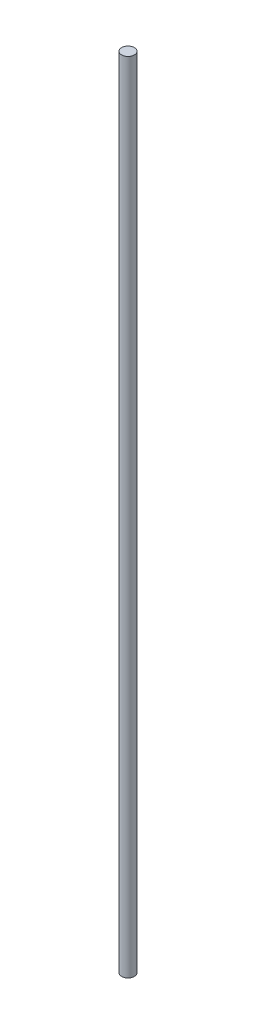
ISO-10303-21;
HEADER;
FILE_DESCRIPTION(('STEP AP214'),'2;1');
FILE_NAME('part.step','',(''),(''),'','','');
FILE_SCHEMA(('AUTOMOTIVE_DESIGN { 1 0 10303 214 1 1 1 1 }'));
ENDSEC;
DATA;
#1=APPLICATION_CONTEXT('core data for automotive mechanical design processes');
#2=APPLICATION_PROTOCOL_DEFINITION('international standard','automotive_design',2000,#1);
#3=PRODUCT_CONTEXT('',#1,'mechanical');
#4=PRODUCT('Part','Part','',(#3));
#5=PRODUCT_RELATED_PRODUCT_CATEGORY('part','',(#4));
#6=PRODUCT_DEFINITION_FORMATION('','',#4);
#7=PRODUCT_DEFINITION_CONTEXT('part definition',#1,'design');
#8=PRODUCT_DEFINITION('design','',#6,#7);
#9=PRODUCT_DEFINITION_SHAPE('','',#8);
#10=(LENGTH_UNIT() NAMED_UNIT(*) SI_UNIT(.MILLI.,.METRE.));
#11=(NAMED_UNIT(*) PLANE_ANGLE_UNIT() SI_UNIT($,.RADIAN.));
#12=(NAMED_UNIT(*) SI_UNIT($,.STERADIAN.) SOLID_ANGLE_UNIT());
#13=UNCERTAINTY_MEASURE_WITH_UNIT(LENGTH_MEASURE(1.E-05),#10,'distance_accuracy_value','');
#14=(GEOMETRIC_REPRESENTATION_CONTEXT(3) GLOBAL_UNCERTAINTY_ASSIGNED_CONTEXT((#13)) GLOBAL_UNIT_ASSIGNED_CONTEXT((#10,
#11,#12)) REPRESENTATION_CONTEXT('',''));
#15=CARTESIAN_POINT('',(0.,0.,0.));
#16=DIRECTION('',(0.,0.,1.));
#17=DIRECTION('',(1.,0.,0.));
#18=AXIS2_PLACEMENT_3D('',#15,#16,#17);
#19=CARTESIAN_POINT('',(0.,750.,0.));
#20=DIRECTION('',(0.,-1.,0.));
#21=DIRECTION('',(0.,0.,-1.));
#22=AXIS2_PLACEMENT_3D('',#19,#20,#21);
#23=CYLINDRICAL_SURFACE('',#22,6.);
#24=CARTESIAN_POINT('',(0.,750.,0.));
#25=DIRECTION('',(0.,1.,0.));
#26=DIRECTION('',(0.,0.,1.));
#27=AXIS2_PLACEMENT_3D('',#24,#25,#26);
#28=CIRCLE('',#27,6.);
#29=CARTESIAN_POINT('',(0.,750.,6.));
#30=VERTEX_POINT('',#29);
#31=EDGE_CURVE('E10',#30,#30,#28,.T.);
#32=ORIENTED_EDGE('',*,*,#31,.F.);
#33=EDGE_LOOP('',(#32));
#34=FACE_BOUND('',#33,.T.);
#35=CARTESIAN_POINT('',(0.,0.,0.));
#36=DIRECTION('',(0.,1.,0.));
#37=DIRECTION('',(0.,0.,1.));
#38=AXIS2_PLACEMENT_3D('',#35,#36,#37);
#39=CIRCLE('',#38,6.);
#40=CARTESIAN_POINT('',(0.,0.,6.));
#41=VERTEX_POINT('',#40);
#42=EDGE_CURVE('E34',#41,#41,#39,.T.);
#43=ORIENTED_EDGE('',*,*,#42,.T.);
#44=EDGE_LOOP('',(#43));
#45=FACE_BOUND('',#44,.T.);
#46=ADVANCED_FACE('F31',(#34,#45),#23,.T.);
#47=CARTESIAN_POINT('',(0.,750.,0.));
#48=DIRECTION('',(0.,1.,0.));
#49=DIRECTION('',(0.,0.,1.));
#50=AXIS2_PLACEMENT_3D('',#47,#48,#49);
#51=PLANE('',#50);
#52=ORIENTED_EDGE('',*,*,#31,.T.);
#53=EDGE_LOOP('',(#52));
#54=FACE_BOUND('',#53,.T.);
#55=ADVANCED_FACE('F46',(#54),#51,.T.);
#56=CARTESIAN_POINT('',(0.,0.,0.));
#57=DIRECTION('',(0.,1.,0.));
#58=DIRECTION('',(0.,0.,1.));
#59=AXIS2_PLACEMENT_3D('',#56,#57,#58);
#60=PLANE('',#59);
#61=ORIENTED_EDGE('',*,*,#42,.F.);
#62=EDGE_LOOP('',(#61));
#63=FACE_BOUND('',#62,.T.);
#64=ADVANCED_FACE('F44',(#63),#60,.F.);
#65=CLOSED_SHELL('',(#46,#55,#64));
#66=MANIFOLD_SOLID_BREP('B2',#65);
#67=ADVANCED_BREP_SHAPE_REPRESENTATION('',(#18,#66),#14);
#68=SHAPE_DEFINITION_REPRESENTATION(#9,#67);
ENDSEC;
END-ISO-10303-21;
